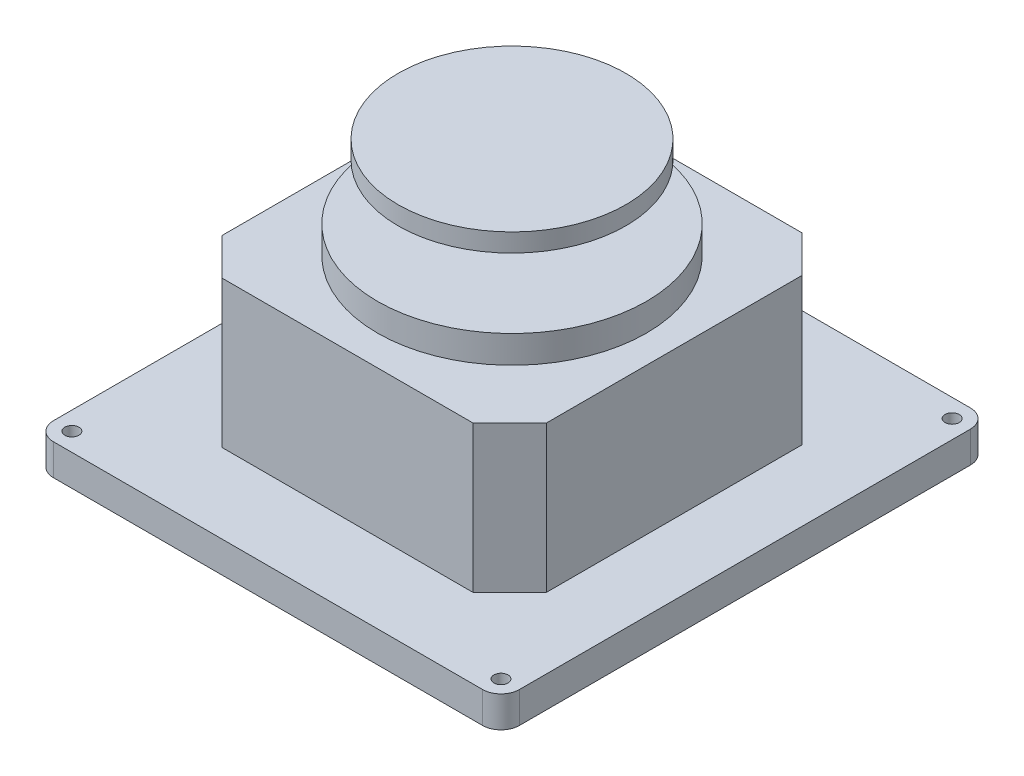
ISO-10303-21;
HEADER;
FILE_DESCRIPTION(('STEP AP214'),'2;1');
FILE_NAME('part.step','',(''),(''),'','','');
FILE_SCHEMA(('AUTOMOTIVE_DESIGN { 1 0 10303 214 1 1 1 1 }'));
ENDSEC;
DATA;
#1=APPLICATION_CONTEXT('core data for automotive mechanical design processes');
#2=APPLICATION_PROTOCOL_DEFINITION('international standard','automotive_design',2000,#1);
#3=PRODUCT_CONTEXT('',#1,'mechanical');
#4=PRODUCT('Part','Part','',(#3));
#5=PRODUCT_RELATED_PRODUCT_CATEGORY('part','',(#4));
#6=PRODUCT_DEFINITION_FORMATION('','',#4);
#7=PRODUCT_DEFINITION_CONTEXT('part definition',#1,'design');
#8=PRODUCT_DEFINITION('design','',#6,#7);
#9=PRODUCT_DEFINITION_SHAPE('','',#8);
#10=(LENGTH_UNIT() NAMED_UNIT(*) SI_UNIT(.MILLI.,.METRE.));
#11=(NAMED_UNIT(*) PLANE_ANGLE_UNIT() SI_UNIT($,.RADIAN.));
#12=(NAMED_UNIT(*) SI_UNIT($,.STERADIAN.) SOLID_ANGLE_UNIT());
#13=UNCERTAINTY_MEASURE_WITH_UNIT(LENGTH_MEASURE(1.E-05),#10,'distance_accuracy_value','');
#14=(GEOMETRIC_REPRESENTATION_CONTEXT(3) GLOBAL_UNCERTAINTY_ASSIGNED_CONTEXT((#13)) GLOBAL_UNIT_ASSIGNED_CONTEXT((#10,
#11,#12)) REPRESENTATION_CONTEXT('',''));
#15=CARTESIAN_POINT('',(0.,0.,0.));
#16=DIRECTION('',(0.,0.,1.));
#17=DIRECTION('',(1.,0.,0.));
#18=AXIS2_PLACEMENT_3D('',#15,#16,#17);
#19=CARTESIAN_POINT('',(0.,8.,0.));
#20=DIRECTION('',(0.,1.,0.));
#21=DIRECTION('',(0.,0.,1.));
#22=AXIS2_PLACEMENT_3D('',#19,#20,#21);
#23=PLANE('',#22);
#24=CARTESIAN_POINT('',(0.,8.,0.));
#25=DIRECTION('',(0.,1.,0.));
#26=DIRECTION('',(0.,0.,1.));
#27=AXIS2_PLACEMENT_3D('',#24,#25,#26);
#28=CIRCLE('',#27,7.33499156850768);
#29=CARTESIAN_POINT('',(0.,8.,7.33499156850768));
#30=VERTEX_POINT('',#29);
#31=EDGE_CURVE('E235',#30,#30,#28,.T.);
#32=ORIENTED_EDGE('',*,*,#31,.F.);
#33=EDGE_LOOP('',(#32));
#34=FACE_BOUND('',#33,.T.);
#35=DIRECTION('',(0.707106781186548,0.,0.707106781186548));
#36=VECTOR('',#35,1.);
#37=CARTESIAN_POINT('',(8.85,8.,-6.975));
#38=LINE('',#37,#36);
#39=CARTESIAN_POINT('',(6.85,8.,-8.975));
#40=VERTEX_POINT('',#39);
#41=CARTESIAN_POINT('',(8.85,8.,-6.975));
#42=VERTEX_POINT('',#41);
#43=EDGE_CURVE('E330',#40,#42,#38,.T.);
#44=ORIENTED_EDGE('',*,*,#43,.F.);
#45=DIRECTION('',(-1.,0.,0.));
#46=VECTOR('',#45,1.);
#47=CARTESIAN_POINT('',(-8.85,8.,-8.975));
#48=LINE('',#47,#46);
#49=CARTESIAN_POINT('',(-6.85,8.,-8.975));
#50=VERTEX_POINT('',#49);
#51=EDGE_CURVE('E224',#40,#50,#48,.T.);
#52=ORIENTED_EDGE('',*,*,#51,.T.);
#53=DIRECTION('',(-0.707106781186548,0.,0.707106781186548));
#54=VECTOR('',#53,1.);
#55=CARTESIAN_POINT('',(-8.85,8.,-6.975));
#56=LINE('',#55,#54);
#57=CARTESIAN_POINT('',(-8.85,8.,-6.975));
#58=VERTEX_POINT('',#57);
#59=EDGE_CURVE('E170',#50,#58,#56,.T.);
#60=ORIENTED_EDGE('',*,*,#59,.T.);
#61=DIRECTION('',(0.,0.,1.));
#62=VECTOR('',#61,1.);
#63=CARTESIAN_POINT('',(-8.85,8.,-8.975));
#64=LINE('',#63,#62);
#65=CARTESIAN_POINT('',(-8.85,8.,6.975));
#66=VERTEX_POINT('',#65);
#67=EDGE_CURVE('E228',#58,#66,#64,.T.);
#68=ORIENTED_EDGE('',*,*,#67,.T.);
#69=DIRECTION('',(-0.707106781186548,0.,-0.707106781186548));
#70=VECTOR('',#69,1.);
#71=CARTESIAN_POINT('',(-8.85,8.,6.975));
#72=LINE('',#71,#70);
#73=CARTESIAN_POINT('',(-6.85,8.,8.975));
#74=VERTEX_POINT('',#73);
#75=EDGE_CURVE('E204',#74,#66,#72,.T.);
#76=ORIENTED_EDGE('',*,*,#75,.F.);
#77=DIRECTION('',(1.,0.,0.));
#78=VECTOR('',#77,1.);
#79=CARTESIAN_POINT('',(-8.85,8.,8.975));
#80=LINE('',#79,#78);
#81=CARTESIAN_POINT('',(6.85,8.,8.975));
#82=VERTEX_POINT('',#81);
#83=EDGE_CURVE('E231',#74,#82,#80,.T.);
#84=ORIENTED_EDGE('',*,*,#83,.T.);
#85=DIRECTION('',(0.707106781186548,0.,-0.707106781186548));
#86=VECTOR('',#85,1.);
#87=CARTESIAN_POINT('',(8.85,8.,6.975));
#88=LINE('',#87,#86);
#89=CARTESIAN_POINT('',(8.85,8.,6.975));
#90=VERTEX_POINT('',#89);
#91=EDGE_CURVE('E186',#82,#90,#88,.T.);
#92=ORIENTED_EDGE('',*,*,#91,.T.);
#93=DIRECTION('',(0.,0.,-1.));
#94=VECTOR('',#93,1.);
#95=CARTESIAN_POINT('',(8.85,8.,-8.975));
#96=LINE('',#95,#94);
#97=EDGE_CURVE('E220',#90,#42,#96,.T.);
#98=ORIENTED_EDGE('',*,*,#97,.T.);
#99=EDGE_LOOP('',(#44,#52,#60,#68,#76,#84,#92,#98));
#100=FACE_BOUND('',#99,.T.);
#101=ADVANCED_FACE('F42',(#34,#100),#23,.T.);
#102=CARTESIAN_POINT('',(-8.85,8.,-8.975));
#103=DIRECTION('',(0.,0.,1.));
#104=DIRECTION('',(1.,0.,0.));
#105=AXIS2_PLACEMENT_3D('',#102,#103,#104);
#106=PLANE('',#105);
#107=ORIENTED_EDGE('',*,*,#51,.F.);
#108=DIRECTION('',(0.,1.,0.));
#109=VECTOR('',#108,1.);
#110=CARTESIAN_POINT('',(6.85,0.,-8.975));
#111=LINE('',#110,#109);
#112=CARTESIAN_POINT('',(6.85,0.,-8.975));
#113=VERTEX_POINT('',#112);
#114=EDGE_CURVE('E178',#113,#40,#111,.T.);
#115=ORIENTED_EDGE('',*,*,#114,.F.);
#116=DIRECTION('',(-1.,0.,0.));
#117=VECTOR('',#116,1.);
#118=CARTESIAN_POINT('',(-8.85,0.,-8.975));
#119=LINE('',#118,#117);
#120=CARTESIAN_POINT('',(-6.85,0.,-8.975));
#121=VERTEX_POINT('',#120);
#122=EDGE_CURVE('E161',#113,#121,#119,.T.);
#123=ORIENTED_EDGE('',*,*,#122,.T.);
#124=DIRECTION('',(0.,1.,0.));
#125=VECTOR('',#124,1.);
#126=CARTESIAN_POINT('',(-6.85,0.,-8.975));
#127=LINE('',#126,#125);
#128=EDGE_CURVE('E177',#121,#50,#127,.T.);
#129=ORIENTED_EDGE('',*,*,#128,.T.);
#130=EDGE_LOOP('',(#107,#115,#123,#129));
#131=FACE_BOUND('',#130,.T.);
#132=ADVANCED_FACE('F176',(#131),#106,.F.);
#133=CARTESIAN_POINT('',(-8.85,8.,-8.975));
#134=DIRECTION('',(1.,0.,0.));
#135=DIRECTION('',(0.,0.,-1.));
#136=AXIS2_PLACEMENT_3D('',#133,#134,#135);
#137=PLANE('',#136);
#138=DIRECTION('',(0.,1.,0.));
#139=VECTOR('',#138,1.);
#140=CARTESIAN_POINT('',(-8.85,0.,-6.975));
#141=LINE('',#140,#139);
#142=CARTESIAN_POINT('',(-8.85,0.,-6.975));
#143=VERTEX_POINT('',#142);
#144=EDGE_CURVE('E169',#143,#58,#141,.T.);
#145=ORIENTED_EDGE('',*,*,#144,.F.);
#146=DIRECTION('',(0.,0.,1.));
#147=VECTOR('',#146,1.);
#148=CARTESIAN_POINT('',(-8.85,0.,-8.975));
#149=LINE('',#148,#147);
#150=CARTESIAN_POINT('',(-8.85,0.,6.97499999999999));
#151=VERTEX_POINT('',#150);
#152=EDGE_CURVE('E164',#143,#151,#149,.T.);
#153=ORIENTED_EDGE('',*,*,#152,.T.);
#154=DIRECTION('',(0.,1.,0.));
#155=VECTOR('',#154,1.);
#156=CARTESIAN_POINT('',(-8.85,0.,6.975));
#157=LINE('',#156,#155);
#158=EDGE_CURVE('E214',#151,#66,#157,.T.);
#159=ORIENTED_EDGE('',*,*,#158,.T.);
#160=ORIENTED_EDGE('',*,*,#67,.F.);
#161=EDGE_LOOP('',(#145,#153,#159,#160));
#162=FACE_BOUND('',#161,.T.);
#163=ADVANCED_FACE('F367',(#162),#137,.F.);
#164=CARTESIAN_POINT('',(8.85,8.,-8.975));
#165=DIRECTION('',(-1.,0.,0.));
#166=DIRECTION('',(0.,0.,1.));
#167=AXIS2_PLACEMENT_3D('',#164,#165,#166);
#168=PLANE('',#167);
#169=DIRECTION('',(0.,0.,-1.));
#170=VECTOR('',#169,1.);
#171=CARTESIAN_POINT('',(8.85,0.,-8.975));
#172=LINE('',#171,#170);
#173=CARTESIAN_POINT('',(8.85,0.,6.975));
#174=VERTEX_POINT('',#173);
#175=CARTESIAN_POINT('',(8.85,0.,-6.975));
#176=VERTEX_POINT('',#175);
#177=EDGE_CURVE('E180',#174,#176,#172,.T.);
#178=ORIENTED_EDGE('',*,*,#177,.T.);
#179=DIRECTION('',(0.,1.,0.));
#180=VECTOR('',#179,1.);
#181=CARTESIAN_POINT('',(8.85,0.,-6.975));
#182=LINE('',#181,#180);
#183=EDGE_CURVE('E339',#176,#42,#182,.T.);
#184=ORIENTED_EDGE('',*,*,#183,.T.);
#185=ORIENTED_EDGE('',*,*,#97,.F.);
#186=DIRECTION('',(0.,1.,0.));
#187=VECTOR('',#186,1.);
#188=CARTESIAN_POINT('',(8.85,0.,6.975));
#189=LINE('',#188,#187);
#190=EDGE_CURVE('E198',#174,#90,#189,.T.);
#191=ORIENTED_EDGE('',*,*,#190,.F.);
#192=EDGE_LOOP('',(#178,#184,#185,#191));
#193=FACE_BOUND('',#192,.T.);
#194=ADVANCED_FACE('F352',(#193),#168,.F.);
#195=CARTESIAN_POINT('',(-8.85,8.,8.975));
#196=DIRECTION('',(0.,0.,-1.));
#197=DIRECTION('',(-1.,0.,0.));
#198=AXIS2_PLACEMENT_3D('',#195,#196,#197);
#199=PLANE('',#198);
#200=DIRECTION('',(0.,1.,0.));
#201=VECTOR('',#200,1.);
#202=CARTESIAN_POINT('',(6.85,0.,8.975));
#203=LINE('',#202,#201);
#204=CARTESIAN_POINT('',(6.84999999999999,0.,8.975));
#205=VERTEX_POINT('',#204);
#206=EDGE_CURVE('E200',#205,#82,#203,.T.);
#207=ORIENTED_EDGE('',*,*,#206,.T.);
#208=ORIENTED_EDGE('',*,*,#83,.F.);
#209=DIRECTION('',(0.,1.,0.));
#210=VECTOR('',#209,1.);
#211=CARTESIAN_POINT('',(-6.85,0.,8.975));
#212=LINE('',#211,#210);
#213=CARTESIAN_POINT('',(-6.85,0.,8.975));
#214=VERTEX_POINT('',#213);
#215=EDGE_CURVE('E210',#214,#74,#212,.T.);
#216=ORIENTED_EDGE('',*,*,#215,.F.);
#217=DIRECTION('',(1.,0.,0.));
#218=VECTOR('',#217,1.);
#219=CARTESIAN_POINT('',(-8.85,0.,8.975));
#220=LINE('',#219,#218);
#221=EDGE_CURVE('E225',#214,#205,#220,.T.);
#222=ORIENTED_EDGE('',*,*,#221,.T.);
#223=EDGE_LOOP('',(#207,#208,#216,#222));
#224=FACE_BOUND('',#223,.T.);
#225=ADVANCED_FACE('F359',(#224),#199,.F.);
#226=CARTESIAN_POINT('',(-8.85,0.,6.975));
#227=DIRECTION('',(0.707106781186547,0.,-0.707106781186547));
#228=DIRECTION('',(-0.707106781186548,0.,-0.707106781186548));
#229=AXIS2_PLACEMENT_3D('',#226,#227,#228);
#230=PLANE('',#229);
#231=ORIENTED_EDGE('',*,*,#75,.T.);
#232=ORIENTED_EDGE('',*,*,#158,.F.);
#233=DIRECTION('',(-0.707106781186548,0.,-0.707106781186548));
#234=VECTOR('',#233,1.);
#235=CARTESIAN_POINT('',(-8.85,0.,6.975));
#236=LINE('',#235,#234);
#237=EDGE_CURVE('E207',#214,#151,#236,.T.);
#238=ORIENTED_EDGE('',*,*,#237,.F.);
#239=ORIENTED_EDGE('',*,*,#215,.T.);
#240=EDGE_LOOP('',(#231,#232,#238,#239));
#241=FACE_BOUND('',#240,.T.);
#242=ADVANCED_FACE('F363',(#241),#230,.F.);
#243=CARTESIAN_POINT('',(8.85,0.,6.975));
#244=DIRECTION('',(0.707106781186547,0.,0.707106781186547));
#245=DIRECTION('',(0.707106781186548,0.,-0.707106781186548));
#246=AXIS2_PLACEMENT_3D('',#243,#244,#245);
#247=PLANE('',#246);
#248=ORIENTED_EDGE('',*,*,#91,.F.);
#249=ORIENTED_EDGE('',*,*,#206,.F.);
#250=DIRECTION('',(0.707106781186548,0.,-0.707106781186548));
#251=VECTOR('',#250,1.);
#252=CARTESIAN_POINT('',(8.85,0.,6.975));
#253=LINE('',#252,#251);
#254=EDGE_CURVE('E191',#205,#174,#253,.T.);
#255=ORIENTED_EDGE('',*,*,#254,.T.);
#256=ORIENTED_EDGE('',*,*,#190,.T.);
#257=EDGE_LOOP('',(#248,#249,#255,#256));
#258=FACE_BOUND('',#257,.T.);
#259=ADVANCED_FACE('F355',(#258),#247,.T.);
#260=CARTESIAN_POINT('',(-8.85,0.,-6.975));
#261=DIRECTION('',(-0.707106781186547,0.,-0.707106781186547));
#262=DIRECTION('',(-0.707106781186548,0.,0.707106781186548));
#263=AXIS2_PLACEMENT_3D('',#260,#261,#262);
#264=PLANE('',#263);
#265=ORIENTED_EDGE('',*,*,#59,.F.);
#266=ORIENTED_EDGE('',*,*,#128,.F.);
#267=DIRECTION('',(-0.707106781186548,0.,0.707106781186548));
#268=VECTOR('',#267,1.);
#269=CARTESIAN_POINT('',(-8.85,0.,-6.975));
#270=LINE('',#269,#268);
#271=EDGE_CURVE('E157',#121,#143,#270,.T.);
#272=ORIENTED_EDGE('',*,*,#271,.T.);
#273=ORIENTED_EDGE('',*,*,#144,.T.);
#274=EDGE_LOOP('',(#265,#266,#272,#273));
#275=FACE_BOUND('',#274,.T.);
#276=ADVANCED_FACE('F183',(#275),#264,.T.);
#277=CARTESIAN_POINT('',(8.85,0.,-6.975));
#278=DIRECTION('',(-0.707106781186547,0.,0.707106781186547));
#279=DIRECTION('',(0.707106781186548,0.,0.707106781186548));
#280=AXIS2_PLACEMENT_3D('',#277,#278,#279);
#281=PLANE('',#280);
#282=ORIENTED_EDGE('',*,*,#43,.T.);
#283=ORIENTED_EDGE('',*,*,#183,.F.);
#284=DIRECTION('',(0.707106781186548,0.,0.707106781186548));
#285=VECTOR('',#284,1.);
#286=CARTESIAN_POINT('',(8.85,0.,-6.975));
#287=LINE('',#286,#285);
#288=EDGE_CURVE('E334',#113,#176,#287,.T.);
#289=ORIENTED_EDGE('',*,*,#288,.F.);
#290=ORIENTED_EDGE('',*,*,#114,.T.);
#291=EDGE_LOOP('',(#282,#283,#289,#290));
#292=FACE_BOUND('',#291,.T.);
#293=ADVANCED_FACE('F346',(#292),#281,.F.);
#294=CARTESIAN_POINT('',(0.,9.5,0.));
#295=DIRECTION('',(0.,-1.,0.));
#296=DIRECTION('',(0.,0.,-1.));
#297=AXIS2_PLACEMENT_3D('',#294,#295,#296);
#298=CYLINDRICAL_SURFACE('',#297,7.33499156850768);
#299=CARTESIAN_POINT('',(0.,9.5,0.));
#300=DIRECTION('',(0.,1.,0.));
#301=DIRECTION('',(0.,0.,1.));
#302=AXIS2_PLACEMENT_3D('',#299,#300,#301);
#303=CIRCLE('',#302,7.33499156850768);
#304=CARTESIAN_POINT('',(0.,9.5,7.33499156850768));
#305=VERTEX_POINT('',#304);
#306=EDGE_CURVE('E323',#305,#305,#303,.T.);
#307=ORIENTED_EDGE('',*,*,#306,.F.);
#308=EDGE_LOOP('',(#307));
#309=FACE_BOUND('',#308,.T.);
#310=ORIENTED_EDGE('',*,*,#31,.T.);
#311=EDGE_LOOP('',(#310));
#312=FACE_BOUND('',#311,.T.);
#313=ADVANCED_FACE('F402',(#309,#312),#298,.T.);
#314=CARTESIAN_POINT('',(0.,9.5,0.));
#315=DIRECTION('',(0.,1.,0.));
#316=DIRECTION('',(0.,0.,1.));
#317=AXIS2_PLACEMENT_3D('',#314,#315,#316);
#318=PLANE('',#317);
#319=CARTESIAN_POINT('',(0.,9.5,0.));
#320=DIRECTION('',(0.,1.,0.));
#321=DIRECTION('',(0.,0.,1.));
#322=AXIS2_PLACEMENT_3D('',#319,#320,#321);
#323=CIRCLE('',#322,1.475);
#324=CARTESIAN_POINT('',(0.,9.5,1.475));
#325=VERTEX_POINT('',#324);
#326=EDGE_CURVE('E249',#325,#325,#323,.T.);
#327=ORIENTED_EDGE('',*,*,#326,.F.);
#328=EDGE_LOOP('',(#327));
#329=FACE_BOUND('',#328,.T.);
#330=ORIENTED_EDGE('',*,*,#306,.T.);
#331=EDGE_LOOP('',(#330));
#332=FACE_BOUND('',#331,.T.);
#333=ADVANCED_FACE('F405',(#329,#332),#318,.T.);
#334=CARTESIAN_POINT('',(0.,12.5,0.));
#335=DIRECTION('',(0.,-1.,0.));
#336=DIRECTION('',(0.,0.,-1.));
#337=AXIS2_PLACEMENT_3D('',#334,#335,#336);
#338=CYLINDRICAL_SURFACE('',#337,1.475);
#339=CARTESIAN_POINT('',(0.,12.5,0.));
#340=DIRECTION('',(0.,1.,0.));
#341=DIRECTION('',(0.,0.,1.));
#342=AXIS2_PLACEMENT_3D('',#339,#340,#341);
#343=CIRCLE('',#342,1.475);
#344=CARTESIAN_POINT('',(0.,12.5,1.475));
#345=VERTEX_POINT('',#344);
#346=EDGE_CURVE('E315',#345,#345,#343,.T.);
#347=ORIENTED_EDGE('',*,*,#346,.F.);
#348=EDGE_LOOP('',(#347));
#349=FACE_BOUND('',#348,.T.);
#350=ORIENTED_EDGE('',*,*,#326,.T.);
#351=EDGE_LOOP('',(#350));
#352=FACE_BOUND('',#351,.T.);
#353=ADVANCED_FACE('F409',(#349,#352),#338,.T.);
#354=CARTESIAN_POINT('',(0.,13.5,0.));
#355=DIRECTION('',(0.,-1.,0.));
#356=DIRECTION('',(0.,0.,-1.));
#357=AXIS2_PLACEMENT_3D('',#354,#355,#356);
#358=CYLINDRICAL_SURFACE('',#357,6.20853656251981);
#359=CARTESIAN_POINT('',(0.,13.5,0.));
#360=DIRECTION('',(0.,1.,0.));
#361=DIRECTION('',(0.,0.,1.));
#362=AXIS2_PLACEMENT_3D('',#359,#360,#361);
#363=CIRCLE('',#362,6.20853656251981);
#364=CARTESIAN_POINT('',(0.,13.5,6.20853656251981));
#365=VERTEX_POINT('',#364);
#366=EDGE_CURVE('E311',#365,#365,#363,.T.);
#367=ORIENTED_EDGE('',*,*,#366,.F.);
#368=EDGE_LOOP('',(#367));
#369=FACE_BOUND('',#368,.T.);
#370=CARTESIAN_POINT('',(0.,12.5,0.));
#371=DIRECTION('',(0.,1.,0.));
#372=DIRECTION('',(0.,0.,1.));
#373=AXIS2_PLACEMENT_3D('',#370,#371,#372);
#374=CIRCLE('',#373,6.20853656251981);
#375=CARTESIAN_POINT('',(0.,12.5,6.20853656251981));
#376=VERTEX_POINT('',#375);
#377=EDGE_CURVE('E316',#376,#376,#374,.T.);
#378=ORIENTED_EDGE('',*,*,#377,.T.);
#379=EDGE_LOOP('',(#378));
#380=FACE_BOUND('',#379,.T.);
#381=ADVANCED_FACE('F413',(#369,#380),#358,.T.);
#382=CARTESIAN_POINT('',(0.,13.5,0.));
#383=DIRECTION('',(0.,1.,0.));
#384=DIRECTION('',(0.,0.,1.));
#385=AXIS2_PLACEMENT_3D('',#382,#383,#384);
#386=PLANE('',#385);
#387=ORIENTED_EDGE('',*,*,#366,.T.);
#388=EDGE_LOOP('',(#387));
#389=FACE_BOUND('',#388,.T.);
#390=ADVANCED_FACE('F417',(#389),#386,.T.);
#391=CARTESIAN_POINT('',(0.,12.5,0.));
#392=DIRECTION('',(0.,1.,0.));
#393=DIRECTION('',(0.,0.,1.));
#394=AXIS2_PLACEMENT_3D('',#391,#392,#393);
#395=PLANE('',#394);
#396=ORIENTED_EDGE('',*,*,#346,.T.);
#397=EDGE_LOOP('',(#396));
#398=FACE_BOUND('',#397,.T.);
#399=ORIENTED_EDGE('',*,*,#377,.F.);
#400=EDGE_LOOP('',(#399));
#401=FACE_BOUND('',#400,.T.);
#402=ADVANCED_FACE('F419',(#398,#401),#395,.F.);
#403=CARTESIAN_POINT('',(12.7,-1.7,13.3));
#404=DIRECTION('',(-1.,0.,0.));
#405=DIRECTION('',(0.,0.,1.));
#406=AXIS2_PLACEMENT_3D('',#403,#404,#405);
#407=PLANE('',#406);
#408=DIRECTION('',(0.,0.,1.));
#409=VECTOR('',#408,1.);
#410=CARTESIAN_POINT('',(12.7,-1.7,13.3));
#411=LINE('',#410,#409);
#412=CARTESIAN_POINT('',(12.7,-1.7,-12.3));
#413=VERTEX_POINT('',#412);
#414=CARTESIAN_POINT('',(12.7,-1.7,12.3));
#415=VERTEX_POINT('',#414);
#416=EDGE_CURVE('E300',#413,#415,#411,.T.);
#417=ORIENTED_EDGE('',*,*,#416,.F.);
#418=DIRECTION('',(0.,1.,0.));
#419=VECTOR('',#418,1.);
#420=CARTESIAN_POINT('',(12.7,-1.7,-12.3));
#421=LINE('',#420,#419);
#422=CARTESIAN_POINT('',(12.7,0.,-12.3));
#423=VERTEX_POINT('',#422);
#424=EDGE_CURVE('E11',#413,#423,#421,.T.);
#425=ORIENTED_EDGE('',*,*,#424,.T.);
#426=DIRECTION('',(0.,0.,1.));
#427=VECTOR('',#426,1.);
#428=CARTESIAN_POINT('',(12.7,0.,13.3));
#429=LINE('',#428,#427);
#430=CARTESIAN_POINT('',(12.7,0.,12.3));
#431=VERTEX_POINT('',#430);
#432=EDGE_CURVE('E497',#423,#431,#429,.T.);
#433=ORIENTED_EDGE('',*,*,#432,.T.);
#434=DIRECTION('',(0.,1.,0.));
#435=VECTOR('',#434,1.);
#436=CARTESIAN_POINT('',(12.7,-1.7,12.3));
#437=LINE('',#436,#435);
#438=EDGE_CURVE('E253',#431,#415,#437,.F.);
#439=ORIENTED_EDGE('',*,*,#438,.T.);
#440=EDGE_LOOP('',(#417,#425,#433,#439));
#441=FACE_BOUND('',#440,.T.);
#442=ADVANCED_FACE('F421',(#441),#407,.F.);
#443=CARTESIAN_POINT('',(-12.7,-1.7,13.3));
#444=DIRECTION('',(0.,0.,-1.));
#445=DIRECTION('',(-1.,0.,0.));
#446=AXIS2_PLACEMENT_3D('',#443,#444,#445);
#447=PLANE('',#446);
#448=DIRECTION('',(-1.,0.,0.));
#449=VECTOR('',#448,1.);
#450=CARTESIAN_POINT('',(-12.7,0.,13.3));
#451=LINE('',#450,#449);
#452=CARTESIAN_POINT('',(11.7,0.,13.3));
#453=VERTEX_POINT('',#452);
#454=CARTESIAN_POINT('',(-11.7,0.,13.3));
#455=VERTEX_POINT('',#454);
#456=EDGE_CURVE('E307',#453,#455,#451,.T.);
#457=ORIENTED_EDGE('',*,*,#456,.T.);
#458=DIRECTION('',(0.,1.,0.));
#459=VECTOR('',#458,1.);
#460=CARTESIAN_POINT('',(-11.7,-1.7,13.3));
#461=LINE('',#460,#459);
#462=CARTESIAN_POINT('',(-11.7,-1.7,13.3));
#463=VERTEX_POINT('',#462);
#464=EDGE_CURVE('E276',#455,#463,#461,.F.);
#465=ORIENTED_EDGE('',*,*,#464,.T.);
#466=DIRECTION('',(-1.,0.,0.));
#467=VECTOR('',#466,1.);
#468=CARTESIAN_POINT('',(-12.7,-1.7,13.3));
#469=LINE('',#468,#467);
#470=CARTESIAN_POINT('',(11.7,-1.7,13.3));
#471=VERTEX_POINT('',#470);
#472=EDGE_CURVE('E305',#471,#463,#469,.T.);
#473=ORIENTED_EDGE('',*,*,#472,.F.);
#474=DIRECTION('',(0.,1.,0.));
#475=VECTOR('',#474,1.);
#476=CARTESIAN_POINT('',(11.7,-1.7,13.3));
#477=LINE('',#476,#475);
#478=EDGE_CURVE('E244',#471,#453,#477,.T.);
#479=ORIENTED_EDGE('',*,*,#478,.T.);
#480=EDGE_LOOP('',(#457,#465,#473,#479));
#481=FACE_BOUND('',#480,.T.);
#482=ADVANCED_FACE('F428',(#481),#447,.F.);
#483=CARTESIAN_POINT('',(-12.7,-1.7,13.3));
#484=DIRECTION('',(1.,0.,0.));
#485=DIRECTION('',(0.,0.,-1.));
#486=AXIS2_PLACEMENT_3D('',#483,#484,#485);
#487=PLANE('',#486);
#488=DIRECTION('',(0.,0.,-1.));
#489=VECTOR('',#488,1.);
#490=CARTESIAN_POINT('',(-12.7,-1.7,13.3));
#491=LINE('',#490,#489);
#492=CARTESIAN_POINT('',(-12.7,-1.7,12.3));
#493=VERTEX_POINT('',#492);
#494=CARTESIAN_POINT('',(-12.7,-1.7,-12.3));
#495=VERTEX_POINT('',#494);
#496=EDGE_CURVE('E504',#493,#495,#491,.T.);
#497=ORIENTED_EDGE('',*,*,#496,.F.);
#498=DIRECTION('',(0.,1.,0.));
#499=VECTOR('',#498,1.);
#500=CARTESIAN_POINT('',(-12.7,-1.7,12.3));
#501=LINE('',#500,#499);
#502=CARTESIAN_POINT('',(-12.7,0.,12.3));
#503=VERTEX_POINT('',#502);
#504=EDGE_CURVE('E263',#493,#503,#501,.T.);
#505=ORIENTED_EDGE('',*,*,#504,.T.);
#506=DIRECTION('',(0.,0.,-1.));
#507=VECTOR('',#506,1.);
#508=CARTESIAN_POINT('',(-12.7,0.,13.3));
#509=LINE('',#508,#507);
#510=CARTESIAN_POINT('',(-12.7,0.,-12.3));
#511=VERTEX_POINT('',#510);
#512=EDGE_CURVE('E301',#503,#511,#509,.T.);
#513=ORIENTED_EDGE('',*,*,#512,.T.);
#514=DIRECTION('',(0.,1.,0.));
#515=VECTOR('',#514,1.);
#516=CARTESIAN_POINT('',(-12.7,-1.7,-12.3));
#517=LINE('',#516,#515);
#518=EDGE_CURVE('E260',#511,#495,#517,.F.);
#519=ORIENTED_EDGE('',*,*,#518,.T.);
#520=EDGE_LOOP('',(#497,#505,#513,#519));
#521=FACE_BOUND('',#520,.T.);
#522=ADVANCED_FACE('F432',(#521),#487,.F.);
#523=CARTESIAN_POINT('',(-12.7,-1.7,-13.3));
#524=DIRECTION('',(0.,0.,1.));
#525=DIRECTION('',(1.,0.,0.));
#526=AXIS2_PLACEMENT_3D('',#523,#524,#525);
#527=PLANE('',#526);
#528=DIRECTION('',(1.,0.,0.));
#529=VECTOR('',#528,1.);
#530=CARTESIAN_POINT('',(-12.7,-1.7,-13.3));
#531=LINE('',#530,#529);
#532=CARTESIAN_POINT('',(-11.7,-1.7,-13.3));
#533=VERTEX_POINT('',#532);
#534=CARTESIAN_POINT('',(11.7,-1.7,-13.3));
#535=VERTEX_POINT('',#534);
#536=EDGE_CURVE('E294',#533,#535,#531,.T.);
#537=ORIENTED_EDGE('',*,*,#536,.F.);
#538=DIRECTION('',(0.,1.,0.));
#539=VECTOR('',#538,1.);
#540=CARTESIAN_POINT('',(-11.7,-1.7,-13.3));
#541=LINE('',#540,#539);
#542=CARTESIAN_POINT('',(-11.7,0.,-13.3));
#543=VERTEX_POINT('',#542);
#544=EDGE_CURVE('E51',#533,#543,#541,.T.);
#545=ORIENTED_EDGE('',*,*,#544,.T.);
#546=DIRECTION('',(1.,0.,0.));
#547=VECTOR('',#546,1.);
#548=CARTESIAN_POINT('',(-12.7,0.,-13.3));
#549=LINE('',#548,#547);
#550=CARTESIAN_POINT('',(11.7,0.,-13.3));
#551=VERTEX_POINT('',#550);
#552=EDGE_CURVE('E293',#543,#551,#549,.T.);
#553=ORIENTED_EDGE('',*,*,#552,.T.);
#554=DIRECTION('',(0.,1.,0.));
#555=VECTOR('',#554,1.);
#556=CARTESIAN_POINT('',(11.7,-1.7,-13.3));
#557=LINE('',#556,#555);
#558=EDGE_CURVE('E58',#551,#535,#557,.F.);
#559=ORIENTED_EDGE('',*,*,#558,.T.);
#560=EDGE_LOOP('',(#537,#545,#553,#559));
#561=FACE_BOUND('',#560,.T.);
#562=ADVANCED_FACE('F292',(#561),#527,.F.);
#563=CARTESIAN_POINT('',(0.,-1.7,0.));
#564=DIRECTION('',(0.,-1.,0.));
#565=DIRECTION('',(0.,0.,-1.));
#566=AXIS2_PLACEMENT_3D('',#563,#564,#565);
#567=PLANE('',#566);
#568=CARTESIAN_POINT('',(11.7,-1.7,12.3));
#569=DIRECTION('',(0.,-1.,0.));
#570=DIRECTION('',(0.,0.,1.));
#571=AXIS2_PLACEMENT_3D('',#568,#569,#570);
#572=CIRCLE('',#571,0.384895333157362);
#573=CARTESIAN_POINT('',(11.7,-1.7,12.6848953331574));
#574=VERTEX_POINT('',#573);
#575=EDGE_CURVE('E470',#574,#574,#572,.T.);
#576=ORIENTED_EDGE('',*,*,#575,.F.);
#577=EDGE_LOOP('',(#576));
#578=FACE_BOUND('',#577,.T.);
#579=CARTESIAN_POINT('',(-11.7,-1.7,12.3));
#580=DIRECTION('',(0.,1.,0.));
#581=DIRECTION('',(0.,0.,1.));
#582=AXIS2_PLACEMENT_3D('',#579,#580,#581);
#583=CIRCLE('',#582,0.384895333157362);
#584=CARTESIAN_POINT('',(-11.7,-1.7,12.6848953331574));
#585=VERTEX_POINT('',#584);
#586=EDGE_CURVE('E474',#585,#585,#583,.T.);
#587=ORIENTED_EDGE('',*,*,#586,.T.);
#588=EDGE_LOOP('',(#587));
#589=FACE_BOUND('',#588,.T.);
#590=CARTESIAN_POINT('',(11.7,-1.7,-12.3));
#591=DIRECTION('',(0.,1.,0.));
#592=DIRECTION('',(0.,0.,-1.));
#593=AXIS2_PLACEMENT_3D('',#590,#591,#592);
#594=CIRCLE('',#593,0.384895333157362);
#595=CARTESIAN_POINT('',(11.7,-1.7,-12.6848953331574));
#596=VERTEX_POINT('',#595);
#597=EDGE_CURVE('E481',#596,#596,#594,.T.);
#598=ORIENTED_EDGE('',*,*,#597,.T.);
#599=EDGE_LOOP('',(#598));
#600=FACE_BOUND('',#599,.T.);
#601=CARTESIAN_POINT('',(-11.7,-1.7,-12.3));
#602=DIRECTION('',(0.,-1.,0.));
#603=DIRECTION('',(0.,0.,-1.));
#604=AXIS2_PLACEMENT_3D('',#601,#602,#603);
#605=CIRCLE('',#604,0.384895333157362);
#606=CARTESIAN_POINT('',(-11.7,-1.7,-12.6848953331574));
#607=VERTEX_POINT('',#606);
#608=EDGE_CURVE('E489',#607,#607,#605,.T.);
#609=ORIENTED_EDGE('',*,*,#608,.F.);
#610=EDGE_LOOP('',(#609));
#611=FACE_BOUND('',#610,.T.);
#612=ORIENTED_EDGE('',*,*,#472,.T.);
#613=CARTESIAN_POINT('',(-11.7,-1.7,12.3));
#614=DIRECTION('',(0.,-1.,0.));
#615=DIRECTION('',(0.,0.,-1.));
#616=AXIS2_PLACEMENT_3D('',#613,#614,#615);
#617=CIRCLE('',#616,1.);
#618=EDGE_CURVE('E284',#463,#493,#617,.T.);
#619=ORIENTED_EDGE('',*,*,#618,.T.);
#620=ORIENTED_EDGE('',*,*,#496,.T.);
#621=CARTESIAN_POINT('',(-11.7,-1.7,-12.3));
#622=DIRECTION('',(0.,-1.,0.));
#623=DIRECTION('',(0.,0.,-1.));
#624=AXIS2_PLACEMENT_3D('',#621,#622,#623);
#625=CIRCLE('',#624,1.);
#626=EDGE_CURVE('E65',#495,#533,#625,.T.);
#627=ORIENTED_EDGE('',*,*,#626,.T.);
#628=ORIENTED_EDGE('',*,*,#536,.T.);
#629=CARTESIAN_POINT('',(11.7,-1.7,-12.3));
#630=DIRECTION('',(0.,-1.,0.));
#631=DIRECTION('',(0.,0.,-1.));
#632=AXIS2_PLACEMENT_3D('',#629,#630,#631);
#633=CIRCLE('',#632,1.);
#634=EDGE_CURVE('E279',#535,#413,#633,.T.);
#635=ORIENTED_EDGE('',*,*,#634,.T.);
#636=ORIENTED_EDGE('',*,*,#416,.T.);
#637=CARTESIAN_POINT('',(11.7,-1.7,12.3));
#638=DIRECTION('',(0.,-1.,0.));
#639=DIRECTION('',(0.,0.,-1.));
#640=AXIS2_PLACEMENT_3D('',#637,#638,#639);
#641=CIRCLE('',#640,1.);
#642=EDGE_CURVE('E257',#415,#471,#641,.T.);
#643=ORIENTED_EDGE('',*,*,#642,.T.);
#644=EDGE_LOOP('',(#612,#619,#620,#627,#628,#635,#636,#643));
#645=FACE_BOUND('',#644,.T.);
#646=ADVANCED_FACE('F439',(#578,#589,#600,#611,#645),#567,.T.);
#647=CARTESIAN_POINT('',(0.,0.,0.));
#648=DIRECTION('',(0.,-1.,0.));
#649=DIRECTION('',(0.,0.,-1.));
#650=AXIS2_PLACEMENT_3D('',#647,#648,#649);
#651=PLANE('',#650);
#652=CARTESIAN_POINT('',(11.7,0.,12.3));
#653=DIRECTION('',(0.,-1.,0.));
#654=DIRECTION('',(0.,0.,1.));
#655=AXIS2_PLACEMENT_3D('',#652,#653,#654);
#656=CIRCLE('',#655,0.384895333157362);
#657=CARTESIAN_POINT('',(11.7,0.,12.6848953331574));
#658=VERTEX_POINT('',#657);
#659=EDGE_CURVE('E467',#658,#658,#656,.T.);
#660=ORIENTED_EDGE('',*,*,#659,.T.);
#661=EDGE_LOOP('',(#660));
#662=FACE_BOUND('',#661,.T.);
#663=CARTESIAN_POINT('',(-11.7,0.,12.3));
#664=DIRECTION('',(0.,1.,0.));
#665=DIRECTION('',(0.,0.,1.));
#666=AXIS2_PLACEMENT_3D('',#663,#664,#665);
#667=CIRCLE('',#666,0.384895333157362);
#668=CARTESIAN_POINT('',(-11.7,0.,12.6848953331574));
#669=VERTEX_POINT('',#668);
#670=EDGE_CURVE('E477',#669,#669,#667,.T.);
#671=ORIENTED_EDGE('',*,*,#670,.F.);
#672=EDGE_LOOP('',(#671));
#673=FACE_BOUND('',#672,.T.);
#674=CARTESIAN_POINT('',(11.7,0.,-12.3));
#675=DIRECTION('',(0.,1.,0.));
#676=DIRECTION('',(0.,0.,-1.));
#677=AXIS2_PLACEMENT_3D('',#674,#675,#676);
#678=CIRCLE('',#677,0.384895333157362);
#679=CARTESIAN_POINT('',(11.7,0.,-12.6848953331574));
#680=VERTEX_POINT('',#679);
#681=EDGE_CURVE('E485',#680,#680,#678,.T.);
#682=ORIENTED_EDGE('',*,*,#681,.F.);
#683=EDGE_LOOP('',(#682));
#684=FACE_BOUND('',#683,.T.);
#685=CARTESIAN_POINT('',(-11.7,0.,-12.3));
#686=DIRECTION('',(0.,-1.,0.));
#687=DIRECTION('',(0.,0.,-1.));
#688=AXIS2_PLACEMENT_3D('',#685,#686,#687);
#689=CIRCLE('',#688,0.384895333157362);
#690=CARTESIAN_POINT('',(-11.7,0.,-12.6848953331574));
#691=VERTEX_POINT('',#690);
#692=EDGE_CURVE('E493',#691,#691,#689,.T.);
#693=ORIENTED_EDGE('',*,*,#692,.T.);
#694=EDGE_LOOP('',(#693));
#695=FACE_BOUND('',#694,.T.);
#696=ORIENTED_EDGE('',*,*,#122,.F.);
#697=ORIENTED_EDGE('',*,*,#288,.T.);
#698=ORIENTED_EDGE('',*,*,#177,.F.);
#699=ORIENTED_EDGE('',*,*,#254,.F.);
#700=ORIENTED_EDGE('',*,*,#221,.F.);
#701=ORIENTED_EDGE('',*,*,#237,.T.);
#702=ORIENTED_EDGE('',*,*,#152,.F.);
#703=ORIENTED_EDGE('',*,*,#271,.F.);
#704=EDGE_LOOP('',(#696,#697,#698,#699,#700,#701,#702,#703));
#705=FACE_BOUND('',#704,.T.);
#706=ORIENTED_EDGE('',*,*,#512,.F.);
#707=CARTESIAN_POINT('',(-11.7,0.,12.3));
#708=DIRECTION('',(0.,-1.,0.));
#709=DIRECTION('',(0.,0.,-1.));
#710=AXIS2_PLACEMENT_3D('',#707,#708,#709);
#711=CIRCLE('',#710,1.);
#712=EDGE_CURVE('E273',#503,#455,#711,.F.);
#713=ORIENTED_EDGE('',*,*,#712,.T.);
#714=ORIENTED_EDGE('',*,*,#456,.F.);
#715=CARTESIAN_POINT('',(11.7,0.,12.3));
#716=DIRECTION('',(0.,-1.,0.));
#717=DIRECTION('',(0.,0.,-1.));
#718=AXIS2_PLACEMENT_3D('',#715,#716,#717);
#719=CIRCLE('',#718,1.);
#720=EDGE_CURVE('E248',#453,#431,#719,.F.);
#721=ORIENTED_EDGE('',*,*,#720,.T.);
#722=ORIENTED_EDGE('',*,*,#432,.F.);
#723=CARTESIAN_POINT('',(11.7,0.,-12.3));
#724=DIRECTION('',(0.,-1.,0.));
#725=DIRECTION('',(0.,0.,-1.));
#726=AXIS2_PLACEMENT_3D('',#723,#724,#725);
#727=CIRCLE('',#726,1.);
#728=EDGE_CURVE('E267',#423,#551,#727,.F.);
#729=ORIENTED_EDGE('',*,*,#728,.T.);
#730=ORIENTED_EDGE('',*,*,#552,.F.);
#731=CARTESIAN_POINT('',(-11.7,0.,-12.3));
#732=DIRECTION('',(0.,-1.,0.));
#733=DIRECTION('',(0.,0.,-1.));
#734=AXIS2_PLACEMENT_3D('',#731,#732,#733);
#735=CIRCLE('',#734,1.);
#736=EDGE_CURVE('E270',#543,#511,#735,.F.);
#737=ORIENTED_EDGE('',*,*,#736,.T.);
#738=EDGE_LOOP('',(#706,#713,#714,#721,#722,#729,#730,#737));
#739=FACE_BOUND('',#738,.T.);
#740=ADVANCED_FACE('F159',(#662,#673,#684,#695,#705,#739),#651,.F.);
#741=CARTESIAN_POINT('',(11.7,-1.7,12.3));
#742=DIRECTION('',(0.,1.,0.));
#743=DIRECTION('',(0.,0.,1.));
#744=AXIS2_PLACEMENT_3D('',#741,#742,#743);
#745=CYLINDRICAL_SURFACE('',#744,1.);
#746=ORIENTED_EDGE('',*,*,#642,.F.);
#747=ORIENTED_EDGE('',*,*,#438,.F.);
#748=ORIENTED_EDGE('',*,*,#720,.F.);
#749=ORIENTED_EDGE('',*,*,#478,.F.);
#750=EDGE_LOOP('',(#746,#747,#748,#749));
#751=FACE_BOUND('',#750,.T.);
#752=ADVANCED_FACE('F442',(#751),#745,.T.);
#753=CARTESIAN_POINT('',(-11.7,-1.7,12.3));
#754=DIRECTION('',(0.,1.,0.));
#755=DIRECTION('',(0.,0.,1.));
#756=AXIS2_PLACEMENT_3D('',#753,#754,#755);
#757=CYLINDRICAL_SURFACE('',#756,1.);
#758=ORIENTED_EDGE('',*,*,#618,.F.);
#759=ORIENTED_EDGE('',*,*,#464,.F.);
#760=ORIENTED_EDGE('',*,*,#712,.F.);
#761=ORIENTED_EDGE('',*,*,#504,.F.);
#762=EDGE_LOOP('',(#758,#759,#760,#761));
#763=FACE_BOUND('',#762,.T.);
#764=ADVANCED_FACE('F518',(#763),#757,.T.);
#765=CARTESIAN_POINT('',(-11.7,-1.7,-12.3));
#766=DIRECTION('',(0.,1.,0.));
#767=DIRECTION('',(0.,0.,1.));
#768=AXIS2_PLACEMENT_3D('',#765,#766,#767);
#769=CYLINDRICAL_SURFACE('',#768,1.);
#770=ORIENTED_EDGE('',*,*,#626,.F.);
#771=ORIENTED_EDGE('',*,*,#518,.F.);
#772=ORIENTED_EDGE('',*,*,#736,.F.);
#773=ORIENTED_EDGE('',*,*,#544,.F.);
#774=EDGE_LOOP('',(#770,#771,#772,#773));
#775=FACE_BOUND('',#774,.T.);
#776=ADVANCED_FACE('F522',(#775),#769,.T.);
#777=CARTESIAN_POINT('',(11.7,-1.7,-12.3));
#778=DIRECTION('',(0.,1.,0.));
#779=DIRECTION('',(0.,0.,1.));
#780=AXIS2_PLACEMENT_3D('',#777,#778,#779);
#781=CYLINDRICAL_SURFACE('',#780,1.);
#782=ORIENTED_EDGE('',*,*,#634,.F.);
#783=ORIENTED_EDGE('',*,*,#558,.F.);
#784=ORIENTED_EDGE('',*,*,#728,.F.);
#785=ORIENTED_EDGE('',*,*,#424,.F.);
#786=EDGE_LOOP('',(#782,#783,#784,#785));
#787=FACE_BOUND('',#786,.T.);
#788=ADVANCED_FACE('F44',(#787),#781,.T.);
#789=CARTESIAN_POINT('',(-11.7,0.,-12.3));
#790=DIRECTION('',(0.,-1.,0.));
#791=DIRECTION('',(0.,0.,-1.));
#792=AXIS2_PLACEMENT_3D('',#789,#790,#791);
#793=CYLINDRICAL_SURFACE('',#792,0.384895333157362);
#794=ORIENTED_EDGE('',*,*,#692,.F.);
#795=EDGE_LOOP('',(#794));
#796=FACE_BOUND('',#795,.T.);
#797=ORIENTED_EDGE('',*,*,#608,.T.);
#798=EDGE_LOOP('',(#797));
#799=FACE_BOUND('',#798,.T.);
#800=ADVANCED_FACE('F447',(#796,#799),#793,.F.);
#801=CARTESIAN_POINT('',(11.7,0.,-12.3));
#802=DIRECTION('',(0.,-1.,0.));
#803=DIRECTION('',(0.,0.,-1.));
#804=AXIS2_PLACEMENT_3D('',#801,#802,#803);
#805=CYLINDRICAL_SURFACE('',#804,0.384895333157362);
#806=ORIENTED_EDGE('',*,*,#681,.T.);
#807=EDGE_LOOP('',(#806));
#808=FACE_BOUND('',#807,.T.);
#809=ORIENTED_EDGE('',*,*,#597,.F.);
#810=EDGE_LOOP('',(#809));
#811=FACE_BOUND('',#810,.T.);
#812=ADVANCED_FACE('F450',(#808,#811),#805,.F.);
#813=CARTESIAN_POINT('',(-11.7,0.,12.3));
#814=DIRECTION('',(0.,-1.,0.));
#815=DIRECTION('',(0.,0.,-1.));
#816=AXIS2_PLACEMENT_3D('',#813,#814,#815);
#817=CYLINDRICAL_SURFACE('',#816,0.384895333157362);
#818=ORIENTED_EDGE('',*,*,#670,.T.);
#819=EDGE_LOOP('',(#818));
#820=FACE_BOUND('',#819,.T.);
#821=ORIENTED_EDGE('',*,*,#586,.F.);
#822=EDGE_LOOP('',(#821));
#823=FACE_BOUND('',#822,.T.);
#824=ADVANCED_FACE('F454',(#820,#823),#817,.F.);
#825=CARTESIAN_POINT('',(11.7,0.,12.3));
#826=DIRECTION('',(0.,-1.,0.));
#827=DIRECTION('',(0.,0.,-1.));
#828=AXIS2_PLACEMENT_3D('',#825,#826,#827);
#829=CYLINDRICAL_SURFACE('',#828,0.384895333157362);
#830=ORIENTED_EDGE('',*,*,#659,.F.);
#831=EDGE_LOOP('',(#830));
#832=FACE_BOUND('',#831,.T.);
#833=ORIENTED_EDGE('',*,*,#575,.T.);
#834=EDGE_LOOP('',(#833));
#835=FACE_BOUND('',#834,.T.);
#836=ADVANCED_FACE('F458',(#832,#835),#829,.F.);
#837=CLOSED_SHELL('',(#101,#132,#163,#194,#225,#242,#259,#276,#293,#313,#333,#353,#381,#390,
#402,#442,#482,#522,#562,#646,#740,#752,#764,#776,#788,#800,#812,#824,#836));
#838=MANIFOLD_SOLID_BREP('B2',#837);
#839=ADVANCED_BREP_SHAPE_REPRESENTATION('',(#18,#838),#14);
#840=SHAPE_DEFINITION_REPRESENTATION(#9,#839);
ENDSEC;
END-ISO-10303-21;
